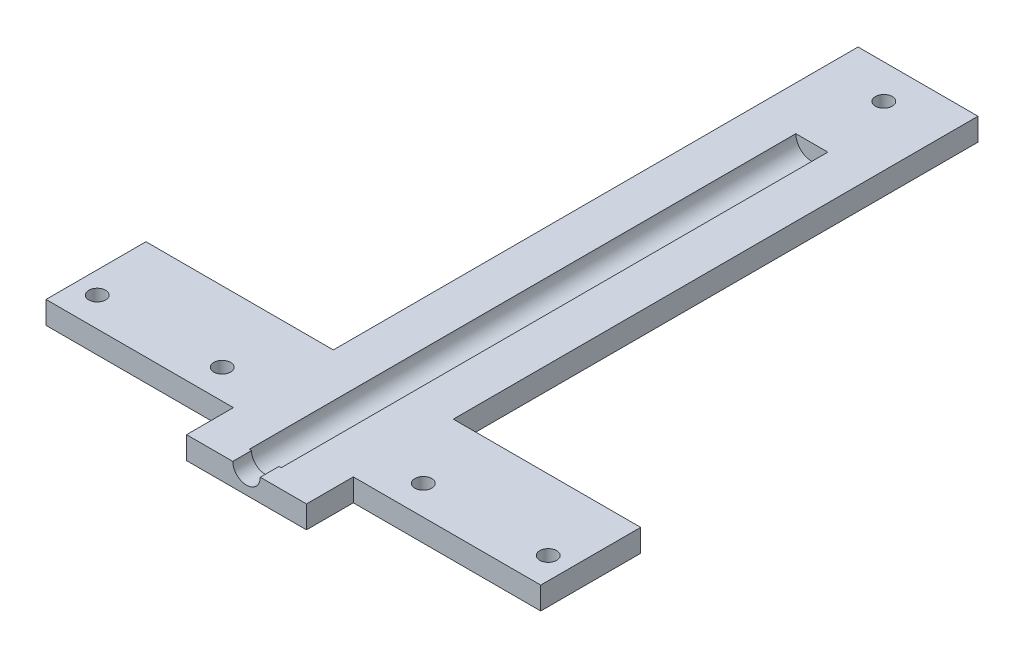
ISO-10303-21;
HEADER;
FILE_DESCRIPTION(('STEP AP214'),'2;1');
FILE_NAME('part.step','',(''),(''),'','','');
FILE_SCHEMA(('AUTOMOTIVE_DESIGN { 1 0 10303 214 1 1 1 1 }'));
ENDSEC;
DATA;
#1=APPLICATION_CONTEXT('core data for automotive mechanical design processes');
#2=APPLICATION_PROTOCOL_DEFINITION('international standard','automotive_design',2000,#1);
#3=PRODUCT_CONTEXT('',#1,'mechanical');
#4=PRODUCT('Part','Part','',(#3));
#5=PRODUCT_RELATED_PRODUCT_CATEGORY('part','',(#4));
#6=PRODUCT_DEFINITION_FORMATION('','',#4);
#7=PRODUCT_DEFINITION_CONTEXT('part definition',#1,'design');
#8=PRODUCT_DEFINITION('design','',#6,#7);
#9=PRODUCT_DEFINITION_SHAPE('','',#8);
#10=(LENGTH_UNIT() NAMED_UNIT(*) SI_UNIT(.MILLI.,.METRE.));
#11=(NAMED_UNIT(*) PLANE_ANGLE_UNIT() SI_UNIT($,.RADIAN.));
#12=(NAMED_UNIT(*) SI_UNIT($,.STERADIAN.) SOLID_ANGLE_UNIT());
#13=UNCERTAINTY_MEASURE_WITH_UNIT(LENGTH_MEASURE(1.E-05),#10,'distance_accuracy_value','');
#14=(GEOMETRIC_REPRESENTATION_CONTEXT(3) GLOBAL_UNCERTAINTY_ASSIGNED_CONTEXT((#13)) GLOBAL_UNIT_ASSIGNED_CONTEXT((#10,
#11,#12)) REPRESENTATION_CONTEXT('',''));
#15=CARTESIAN_POINT('',(0.,0.,0.));
#16=DIRECTION('',(0.,0.,1.));
#17=DIRECTION('',(1.,0.,0.));
#18=AXIS2_PLACEMENT_3D('',#15,#16,#17);
#19=CARTESIAN_POINT('',(0.,4.572,0.));
#20=DIRECTION('',(0.,1.,0.));
#21=DIRECTION('',(0.,0.,1.));
#22=AXIS2_PLACEMENT_3D('',#19,#20,#21);
#23=PLANE('',#22);
#24=CARTESIAN_POINT('',(-50.292,4.572,-120.0404));
#25=DIRECTION('',(0.,1.,0.));
#26=DIRECTION('',(0.,0.,1.));
#27=AXIS2_PLACEMENT_3D('',#24,#25,#26);
#28=CIRCLE('',#27,1.7145);
#29=CARTESIAN_POINT('',(-50.292,4.572,-118.3259));
#30=VERTEX_POINT('',#29);
#31=EDGE_CURVE('E222',#30,#30,#28,.T.);
#32=ORIENTED_EDGE('',*,*,#31,.F.);
#33=EDGE_LOOP('',(#32));
#34=FACE_BOUND('',#33,.T.);
#35=CARTESIAN_POINT('',(-70.739,4.572,-5.96899999999999));
#36=DIRECTION('',(0.,1.,0.));
#37=DIRECTION('',(0.,0.,1.));
#38=AXIS2_PLACEMENT_3D('',#35,#36,#37);
#39=CIRCLE('',#38,1.7145);
#40=CARTESIAN_POINT('',(-70.739,4.572,-4.25449999999999));
#41=VERTEX_POINT('',#40);
#42=EDGE_CURVE('E499',#41,#41,#39,.T.);
#43=ORIENTED_EDGE('',*,*,#42,.F.);
#44=EDGE_LOOP('',(#43));
#45=FACE_BOUND('',#44,.T.);
#46=CARTESIAN_POINT('',(-4.445,4.572,-5.96899999999999));
#47=DIRECTION('',(0.,1.,0.));
#48=DIRECTION('',(0.,0.,1.));
#49=AXIS2_PLACEMENT_3D('',#46,#47,#48);
#50=CIRCLE('',#49,1.7145);
#51=CARTESIAN_POINT('',(-4.445,4.572,-4.25449999999999));
#52=VERTEX_POINT('',#51);
#53=EDGE_CURVE('E502',#52,#52,#50,.T.);
#54=ORIENTED_EDGE('',*,*,#53,.F.);
#55=EDGE_LOOP('',(#54));
#56=FACE_BOUND('',#55,.T.);
#57=CARTESIAN_POINT('',(-29.845,4.572,-5.96899999999998));
#58=DIRECTION('',(0.,1.,0.));
#59=DIRECTION('',(0.,0.,1.));
#60=AXIS2_PLACEMENT_3D('',#57,#58,#59);
#61=CIRCLE('',#60,1.7145);
#62=CARTESIAN_POINT('',(-29.845,4.572,-4.25449999999998));
#63=VERTEX_POINT('',#62);
#64=EDGE_CURVE('E505',#63,#63,#61,.T.);
#65=ORIENTED_EDGE('',*,*,#64,.F.);
#66=EDGE_LOOP('',(#65));
#67=FACE_BOUND('',#66,.T.);
#68=CARTESIAN_POINT('',(-96.139,4.572,-5.96899999999999));
#69=DIRECTION('',(0.,1.,0.));
#70=DIRECTION('',(0.,0.,1.));
#71=AXIS2_PLACEMENT_3D('',#68,#69,#70);
#72=CIRCLE('',#71,1.7145);
#73=CARTESIAN_POINT('',(-96.139,4.572,-4.25449999999999));
#74=VERTEX_POINT('',#73);
#75=EDGE_CURVE('E508',#74,#74,#72,.T.);
#76=ORIENTED_EDGE('',*,*,#75,.F.);
#77=EDGE_LOOP('',(#76));
#78=FACE_BOUND('',#77,.T.);
#79=DIRECTION('',(0.,0.,1.));
#80=VECTOR('',#79,1.);
#81=CARTESIAN_POINT('',(-47.0408,4.572,-105.41));
#82=LINE('',#81,#80);
#83=CARTESIAN_POINT('',(-47.0408,4.572,-105.41));
#84=VERTEX_POINT('',#83);
#85=CARTESIAN_POINT('',(-47.0408,4.572,5.715));
#86=VERTEX_POINT('',#85);
#87=EDGE_CURVE('E474',#84,#86,#82,.T.);
#88=ORIENTED_EDGE('',*,*,#87,.T.);
#89=DIRECTION('',(-1.,0.,0.));
#90=VECTOR('',#89,1.);
#91=CARTESIAN_POINT('',(-53.5432,4.572,5.715));
#92=LINE('',#91,#90);
#93=CARTESIAN_POINT('',(-47.498,4.572,5.715));
#94=VERTEX_POINT('',#93);
#95=EDGE_CURVE('E470',#86,#94,#92,.T.);
#96=ORIENTED_EDGE('',*,*,#95,.T.);
#97=DIRECTION('',(0.,0.,1.));
#98=VECTOR('',#97,1.);
#99=CARTESIAN_POINT('',(-47.498,4.572,5.715));
#100=LINE('',#99,#98);
#101=CARTESIAN_POINT('',(-47.498,4.572,9.525));
#102=VERTEX_POINT('',#101);
#103=EDGE_CURVE('E490',#94,#102,#100,.T.);
#104=ORIENTED_EDGE('',*,*,#103,.T.);
#105=DIRECTION('',(-1.,0.,0.));
#106=VECTOR('',#105,1.);
#107=CARTESIAN_POINT('',(0.,4.572,9.525));
#108=LINE('',#107,#106);
#109=CARTESIAN_POINT('',(-38.1,4.572,9.525));
#110=VERTEX_POINT('',#109);
#111=EDGE_CURVE('E223',#110,#102,#108,.T.);
#112=ORIENTED_EDGE('',*,*,#111,.F.);
#113=DIRECTION('',(0.,0.,1.));
#114=VECTOR('',#113,1.);
#115=CARTESIAN_POINT('',(-38.1,4.572,0.));
#116=LINE('',#115,#114);
#117=CARTESIAN_POINT('',(-38.1,4.572,0.));
#118=VERTEX_POINT('',#117);
#119=EDGE_CURVE('E510',#118,#110,#116,.T.);
#120=ORIENTED_EDGE('',*,*,#119,.F.);
#121=DIRECTION('',(1.,0.,0.));
#122=VECTOR('',#121,1.);
#123=CARTESIAN_POINT('',(0.,4.572,0.));
#124=LINE('',#123,#122);
#125=CARTESIAN_POINT('',(0.,4.572,0.));
#126=VERTEX_POINT('',#125);
#127=EDGE_CURVE('E512',#118,#126,#124,.T.);
#128=ORIENTED_EDGE('',*,*,#127,.T.);
#129=DIRECTION('',(0.,0.,-1.));
#130=VECTOR('',#129,1.);
#131=CARTESIAN_POINT('',(0.,4.572,0.));
#132=LINE('',#131,#130);
#133=CARTESIAN_POINT('',(0.,4.572,-20.32));
#134=VERTEX_POINT('',#133);
#135=EDGE_CURVE('E185',#126,#134,#132,.T.);
#136=ORIENTED_EDGE('',*,*,#135,.T.);
#137=DIRECTION('',(-1.,0.,0.));
#138=VECTOR('',#137,1.);
#139=CARTESIAN_POINT('',(0.,4.572,-20.32));
#140=LINE('',#139,#138);
#141=CARTESIAN_POINT('',(-38.1,4.572,-20.32));
#142=VERTEX_POINT('',#141);
#143=EDGE_CURVE('E515',#134,#142,#140,.T.);
#144=ORIENTED_EDGE('',*,*,#143,.T.);
#145=DIRECTION('',(0.,0.,1.));
#146=VECTOR('',#145,1.);
#147=CARTESIAN_POINT('',(-38.1,4.572,0.));
#148=LINE('',#147,#146);
#149=CARTESIAN_POINT('',(-38.1,4.572,-127.));
#150=VERTEX_POINT('',#149);
#151=EDGE_CURVE('E517',#150,#142,#148,.T.);
#152=ORIENTED_EDGE('',*,*,#151,.F.);
#153=DIRECTION('',(-1.,0.,0.));
#154=VECTOR('',#153,1.);
#155=CARTESIAN_POINT('',(0.,4.572,-127.));
#156=LINE('',#155,#154);
#157=CARTESIAN_POINT('',(-62.484,4.572,-127.));
#158=VERTEX_POINT('',#157);
#159=EDGE_CURVE('E520',#150,#158,#156,.T.);
#160=ORIENTED_EDGE('',*,*,#159,.T.);
#161=DIRECTION('',(0.,0.,1.));
#162=VECTOR('',#161,1.);
#163=CARTESIAN_POINT('',(-62.484,4.572,0.));
#164=LINE('',#163,#162);
#165=CARTESIAN_POINT('',(-62.484,4.572,-20.32));
#166=VERTEX_POINT('',#165);
#167=EDGE_CURVE('E523',#158,#166,#164,.T.);
#168=ORIENTED_EDGE('',*,*,#167,.T.);
#169=DIRECTION('',(1.,0.,0.));
#170=VECTOR('',#169,1.);
#171=CARTESIAN_POINT('',(0.,4.572,-20.32));
#172=LINE('',#171,#170);
#173=CARTESIAN_POINT('',(-100.584,4.572,-20.32));
#174=VERTEX_POINT('',#173);
#175=EDGE_CURVE('E525',#174,#166,#172,.T.);
#176=ORIENTED_EDGE('',*,*,#175,.F.);
#177=DIRECTION('',(0.,0.,-1.));
#178=VECTOR('',#177,1.);
#179=CARTESIAN_POINT('',(-100.584,4.572,0.));
#180=LINE('',#179,#178);
#181=CARTESIAN_POINT('',(-100.584,4.572,0.));
#182=VERTEX_POINT('',#181);
#183=EDGE_CURVE('E151',#182,#174,#180,.T.);
#184=ORIENTED_EDGE('',*,*,#183,.F.);
#185=DIRECTION('',(1.,0.,0.));
#186=VECTOR('',#185,1.);
#187=CARTESIAN_POINT('',(0.,4.572,0.));
#188=LINE('',#187,#186);
#189=CARTESIAN_POINT('',(-62.484,4.572,0.));
#190=VERTEX_POINT('',#189);
#191=EDGE_CURVE('E144',#182,#190,#188,.T.);
#192=ORIENTED_EDGE('',*,*,#191,.T.);
#193=DIRECTION('',(0.,0.,1.));
#194=VECTOR('',#193,1.);
#195=CARTESIAN_POINT('',(-62.484,4.572,0.));
#196=LINE('',#195,#194);
#197=CARTESIAN_POINT('',(-62.484,4.572,9.525));
#198=VERTEX_POINT('',#197);
#199=EDGE_CURVE('E135',#190,#198,#196,.T.);
#200=ORIENTED_EDGE('',*,*,#199,.T.);
#201=CARTESIAN_POINT('',(-53.086,4.572,9.525));
#202=VERTEX_POINT('',#201);
#203=EDGE_CURVE('E143',#202,#198,#108,.T.);
#204=ORIENTED_EDGE('',*,*,#203,.F.);
#205=DIRECTION('',(0.,0.,1.));
#206=VECTOR('',#205,1.);
#207=CARTESIAN_POINT('',(-53.086,4.572,5.715));
#208=LINE('',#207,#206);
#209=CARTESIAN_POINT('',(-53.086,4.572,5.715));
#210=VERTEX_POINT('',#209);
#211=EDGE_CURVE('E233',#210,#202,#208,.T.);
#212=ORIENTED_EDGE('',*,*,#211,.F.);
#213=CARTESIAN_POINT('',(-53.5432,4.572,5.715));
#214=VERTEX_POINT('',#213);
#215=EDGE_CURVE('E483',#210,#214,#92,.T.);
#216=ORIENTED_EDGE('',*,*,#215,.T.);
#217=DIRECTION('',(0.,0.,1.));
#218=VECTOR('',#217,1.);
#219=CARTESIAN_POINT('',(-53.5432,4.572,-105.41));
#220=LINE('',#219,#218);
#221=CARTESIAN_POINT('',(-53.5432,4.572,-105.41));
#222=VERTEX_POINT('',#221);
#223=EDGE_CURVE('E476',#222,#214,#220,.T.);
#224=ORIENTED_EDGE('',*,*,#223,.F.);
#225=DIRECTION('',(-1.,0.,0.));
#226=VECTOR('',#225,1.);
#227=CARTESIAN_POINT('',(-53.5432,4.572,-105.41));
#228=LINE('',#227,#226);
#229=EDGE_CURVE('E464',#84,#222,#228,.T.);
#230=ORIENTED_EDGE('',*,*,#229,.F.);
#231=EDGE_LOOP('',(#88,#96,#104,#112,#120,#128,#136,#144,#152,#160,#168,#176,#184,#192,#200,
#204,#212,#216,#224,#230));
#232=FACE_BOUND('',#231,.T.);
#233=ADVANCED_FACE('F39',(#34,#45,#56,#67,#78,#232),#23,.T.);
#234=CARTESIAN_POINT('',(-38.1,4.572,0.));
#235=DIRECTION('',(1.,0.,0.));
#236=DIRECTION('',(0.,0.,-1.));
#237=AXIS2_PLACEMENT_3D('',#234,#235,#236);
#238=PLANE('',#237);
#239=DIRECTION('',(0.,0.,1.));
#240=VECTOR('',#239,1.);
#241=CARTESIAN_POINT('',(-38.1,0.,0.));
#242=LINE('',#241,#240);
#243=CARTESIAN_POINT('',(-38.1,0.,0.));
#244=VERTEX_POINT('',#243);
#245=CARTESIAN_POINT('',(-38.1,0.,9.525));
#246=VERTEX_POINT('',#245);
#247=EDGE_CURVE('E192',#244,#246,#242,.T.);
#248=ORIENTED_EDGE('',*,*,#247,.F.);
#249=DIRECTION('',(0.,-1.,0.));
#250=VECTOR('',#249,1.);
#251=CARTESIAN_POINT('',(-38.1,4.572,0.));
#252=LINE('',#251,#250);
#253=EDGE_CURVE('E11',#118,#244,#252,.T.);
#254=ORIENTED_EDGE('',*,*,#253,.F.);
#255=ORIENTED_EDGE('',*,*,#119,.T.);
#256=DIRECTION('',(0.,-1.,0.));
#257=VECTOR('',#256,1.);
#258=CARTESIAN_POINT('',(-38.1,4.572,9.525));
#259=LINE('',#258,#257);
#260=EDGE_CURVE('E56',#110,#246,#259,.T.);
#261=ORIENTED_EDGE('',*,*,#260,.T.);
#262=EDGE_LOOP('',(#248,#254,#255,#261));
#263=FACE_BOUND('',#262,.T.);
#264=ADVANCED_FACE('F262',(#263),#238,.T.);
#265=CARTESIAN_POINT('',(0.,4.572,0.));
#266=DIRECTION('',(0.,0.,-1.));
#267=DIRECTION('',(-1.,0.,0.));
#268=AXIS2_PLACEMENT_3D('',#265,#266,#267);
#269=PLANE('',#268);
#270=DIRECTION('',(1.,0.,0.));
#271=VECTOR('',#270,1.);
#272=CARTESIAN_POINT('',(0.,0.,0.));
#273=LINE('',#272,#271);
#274=CARTESIAN_POINT('',(0.,0.,0.));
#275=VERTEX_POINT('',#274);
#276=EDGE_CURVE('E189',#244,#275,#273,.T.);
#277=ORIENTED_EDGE('',*,*,#276,.T.);
#278=DIRECTION('',(0.,-1.,0.));
#279=VECTOR('',#278,1.);
#280=CARTESIAN_POINT('',(0.,4.572,0.));
#281=LINE('',#280,#279);
#282=EDGE_CURVE('E48',#126,#275,#281,.T.);
#283=ORIENTED_EDGE('',*,*,#282,.F.);
#284=ORIENTED_EDGE('',*,*,#127,.F.);
#285=ORIENTED_EDGE('',*,*,#253,.T.);
#286=EDGE_LOOP('',(#277,#283,#284,#285));
#287=FACE_BOUND('',#286,.T.);
#288=ADVANCED_FACE('F190',(#287),#269,.F.);
#289=CARTESIAN_POINT('',(0.,4.572,0.));
#290=DIRECTION('',(-1.,0.,0.));
#291=DIRECTION('',(0.,0.,1.));
#292=AXIS2_PLACEMENT_3D('',#289,#290,#291);
#293=PLANE('',#292);
#294=DIRECTION('',(0.,0.,-1.));
#295=VECTOR('',#294,1.);
#296=CARTESIAN_POINT('',(0.,0.,0.));
#297=LINE('',#296,#295);
#298=CARTESIAN_POINT('',(0.,0.,-20.32));
#299=VERTEX_POINT('',#298);
#300=EDGE_CURVE('E183',#275,#299,#297,.T.);
#301=ORIENTED_EDGE('',*,*,#300,.T.);
#302=DIRECTION('',(0.,-1.,0.));
#303=VECTOR('',#302,1.);
#304=CARTESIAN_POINT('',(0.,4.572,-20.32));
#305=LINE('',#304,#303);
#306=EDGE_CURVE('E174',#134,#299,#305,.T.);
#307=ORIENTED_EDGE('',*,*,#306,.F.);
#308=ORIENTED_EDGE('',*,*,#135,.F.);
#309=ORIENTED_EDGE('',*,*,#282,.T.);
#310=EDGE_LOOP('',(#301,#307,#308,#309));
#311=FACE_BOUND('',#310,.T.);
#312=ADVANCED_FACE('F181',(#311),#293,.F.);
#313=CARTESIAN_POINT('',(0.,4.572,-20.32));
#314=DIRECTION('',(0.,0.,1.));
#315=DIRECTION('',(1.,0.,0.));
#316=AXIS2_PLACEMENT_3D('',#313,#314,#315);
#317=PLANE('',#316);
#318=DIRECTION('',(-1.,0.,0.));
#319=VECTOR('',#318,1.);
#320=CARTESIAN_POINT('',(0.,0.,-20.32));
#321=LINE('',#320,#319);
#322=CARTESIAN_POINT('',(-38.1,0.,-20.32));
#323=VERTEX_POINT('',#322);
#324=EDGE_CURVE('E194',#299,#323,#321,.T.);
#325=ORIENTED_EDGE('',*,*,#324,.T.);
#326=DIRECTION('',(0.,-1.,0.));
#327=VECTOR('',#326,1.);
#328=CARTESIAN_POINT('',(-38.1,4.572,-20.32));
#329=LINE('',#328,#327);
#330=EDGE_CURVE('E172',#142,#323,#329,.T.);
#331=ORIENTED_EDGE('',*,*,#330,.F.);
#332=ORIENTED_EDGE('',*,*,#143,.F.);
#333=ORIENTED_EDGE('',*,*,#306,.T.);
#334=EDGE_LOOP('',(#325,#331,#332,#333));
#335=FACE_BOUND('',#334,.T.);
#336=ADVANCED_FACE('F301',(#335),#317,.F.);
#337=CARTESIAN_POINT('',(-38.1,4.572,0.));
#338=DIRECTION('',(1.,0.,0.));
#339=DIRECTION('',(0.,0.,-1.));
#340=AXIS2_PLACEMENT_3D('',#337,#338,#339);
#341=PLANE('',#340);
#342=DIRECTION('',(0.,0.,1.));
#343=VECTOR('',#342,1.);
#344=CARTESIAN_POINT('',(-38.1,0.,0.));
#345=LINE('',#344,#343);
#346=CARTESIAN_POINT('',(-38.1,0.,-127.));
#347=VERTEX_POINT('',#346);
#348=EDGE_CURVE('E202',#347,#323,#345,.T.);
#349=ORIENTED_EDGE('',*,*,#348,.F.);
#350=DIRECTION('',(0.,-1.,0.));
#351=VECTOR('',#350,1.);
#352=CARTESIAN_POINT('',(-38.1,4.572,-127.));
#353=LINE('',#352,#351);
#354=EDGE_CURVE('E170',#150,#347,#353,.T.);
#355=ORIENTED_EDGE('',*,*,#354,.F.);
#356=ORIENTED_EDGE('',*,*,#151,.T.);
#357=ORIENTED_EDGE('',*,*,#330,.T.);
#358=EDGE_LOOP('',(#349,#355,#356,#357));
#359=FACE_BOUND('',#358,.T.);
#360=ADVANCED_FACE('F297',(#359),#341,.T.);
#361=CARTESIAN_POINT('',(0.,4.572,-127.));
#362=DIRECTION('',(0.,0.,1.));
#363=DIRECTION('',(1.,0.,0.));
#364=AXIS2_PLACEMENT_3D('',#361,#362,#363);
#365=PLANE('',#364);
#366=DIRECTION('',(-1.,0.,0.));
#367=VECTOR('',#366,1.);
#368=CARTESIAN_POINT('',(0.,0.,-127.));
#369=LINE('',#368,#367);
#370=CARTESIAN_POINT('',(-62.484,0.,-127.));
#371=VERTEX_POINT('',#370);
#372=EDGE_CURVE('E205',#347,#371,#369,.T.);
#373=ORIENTED_EDGE('',*,*,#372,.T.);
#374=DIRECTION('',(0.,-1.,0.));
#375=VECTOR('',#374,1.);
#376=CARTESIAN_POINT('',(-62.484,4.572,-127.));
#377=LINE('',#376,#375);
#378=EDGE_CURVE('E167',#158,#371,#377,.T.);
#379=ORIENTED_EDGE('',*,*,#378,.F.);
#380=ORIENTED_EDGE('',*,*,#159,.F.);
#381=ORIENTED_EDGE('',*,*,#354,.T.);
#382=EDGE_LOOP('',(#373,#379,#380,#381));
#383=FACE_BOUND('',#382,.T.);
#384=ADVANCED_FACE('F293',(#383),#365,.F.);
#385=CARTESIAN_POINT('',(-62.484,4.572,0.));
#386=DIRECTION('',(1.,0.,0.));
#387=DIRECTION('',(0.,0.,-1.));
#388=AXIS2_PLACEMENT_3D('',#385,#386,#387);
#389=PLANE('',#388);
#390=DIRECTION('',(0.,0.,1.));
#391=VECTOR('',#390,1.);
#392=CARTESIAN_POINT('',(-62.484,0.,0.));
#393=LINE('',#392,#391);
#394=CARTESIAN_POINT('',(-62.484,0.,-20.32));
#395=VERTEX_POINT('',#394);
#396=EDGE_CURVE('E208',#371,#395,#393,.T.);
#397=ORIENTED_EDGE('',*,*,#396,.T.);
#398=DIRECTION('',(0.,-1.,0.));
#399=VECTOR('',#398,1.);
#400=CARTESIAN_POINT('',(-62.484,4.572,-20.32));
#401=LINE('',#400,#399);
#402=EDGE_CURVE('E165',#166,#395,#401,.T.);
#403=ORIENTED_EDGE('',*,*,#402,.F.);
#404=ORIENTED_EDGE('',*,*,#167,.F.);
#405=ORIENTED_EDGE('',*,*,#378,.T.);
#406=EDGE_LOOP('',(#397,#403,#404,#405));
#407=FACE_BOUND('',#406,.T.);
#408=ADVANCED_FACE('F289',(#407),#389,.F.);
#409=CARTESIAN_POINT('',(0.,4.572,-20.32));
#410=DIRECTION('',(0.,0.,-1.));
#411=DIRECTION('',(-1.,0.,0.));
#412=AXIS2_PLACEMENT_3D('',#409,#410,#411);
#413=PLANE('',#412);
#414=DIRECTION('',(1.,0.,0.));
#415=VECTOR('',#414,1.);
#416=CARTESIAN_POINT('',(0.,0.,-20.32));
#417=LINE('',#416,#415);
#418=CARTESIAN_POINT('',(-100.584,0.,-20.32));
#419=VERTEX_POINT('',#418);
#420=EDGE_CURVE('E211',#419,#395,#417,.T.);
#421=ORIENTED_EDGE('',*,*,#420,.F.);
#422=DIRECTION('',(0.,-1.,0.));
#423=VECTOR('',#422,1.);
#424=CARTESIAN_POINT('',(-100.584,4.572,-20.32));
#425=LINE('',#424,#423);
#426=EDGE_CURVE('E159',#174,#419,#425,.T.);
#427=ORIENTED_EDGE('',*,*,#426,.F.);
#428=ORIENTED_EDGE('',*,*,#175,.T.);
#429=ORIENTED_EDGE('',*,*,#402,.T.);
#430=EDGE_LOOP('',(#421,#427,#428,#429));
#431=FACE_BOUND('',#430,.T.);
#432=ADVANCED_FACE('F285',(#431),#413,.T.);
#433=CARTESIAN_POINT('',(-100.584,4.572,0.));
#434=DIRECTION('',(-1.,0.,0.));
#435=DIRECTION('',(0.,0.,1.));
#436=AXIS2_PLACEMENT_3D('',#433,#434,#435);
#437=PLANE('',#436);
#438=DIRECTION('',(0.,0.,-1.));
#439=VECTOR('',#438,1.);
#440=CARTESIAN_POINT('',(-100.584,0.,0.));
#441=LINE('',#440,#439);
#442=CARTESIAN_POINT('',(-100.584,0.,0.));
#443=VERTEX_POINT('',#442);
#444=EDGE_CURVE('E214',#443,#419,#441,.T.);
#445=ORIENTED_EDGE('',*,*,#444,.F.);
#446=DIRECTION('',(0.,-1.,0.));
#447=VECTOR('',#446,1.);
#448=CARTESIAN_POINT('',(-100.584,4.572,0.));
#449=LINE('',#448,#447);
#450=EDGE_CURVE('E157',#182,#443,#449,.T.);
#451=ORIENTED_EDGE('',*,*,#450,.F.);
#452=ORIENTED_EDGE('',*,*,#183,.T.);
#453=ORIENTED_EDGE('',*,*,#426,.T.);
#454=EDGE_LOOP('',(#445,#451,#452,#453));
#455=FACE_BOUND('',#454,.T.);
#456=ADVANCED_FACE('F282',(#455),#437,.T.);
#457=CARTESIAN_POINT('',(0.,4.572,0.));
#458=DIRECTION('',(0.,0.,-1.));
#459=DIRECTION('',(-1.,0.,0.));
#460=AXIS2_PLACEMENT_3D('',#457,#458,#459);
#461=PLANE('',#460);
#462=DIRECTION('',(1.,0.,0.));
#463=VECTOR('',#462,1.);
#464=CARTESIAN_POINT('',(0.,0.,0.));
#465=LINE('',#464,#463);
#466=CARTESIAN_POINT('',(-62.484,0.,0.));
#467=VERTEX_POINT('',#466);
#468=EDGE_CURVE('E156',#443,#467,#465,.T.);
#469=ORIENTED_EDGE('',*,*,#468,.T.);
#470=DIRECTION('',(0.,-1.,0.));
#471=VECTOR('',#470,1.);
#472=CARTESIAN_POINT('',(-62.484,4.572,0.));
#473=LINE('',#472,#471);
#474=EDGE_CURVE('E139',#190,#467,#473,.T.);
#475=ORIENTED_EDGE('',*,*,#474,.F.);
#476=ORIENTED_EDGE('',*,*,#191,.F.);
#477=ORIENTED_EDGE('',*,*,#450,.T.);
#478=EDGE_LOOP('',(#469,#475,#476,#477));
#479=FACE_BOUND('',#478,.T.);
#480=ADVANCED_FACE('F154',(#479),#461,.F.);
#481=CARTESIAN_POINT('',(-62.484,4.572,0.));
#482=DIRECTION('',(1.,0.,0.));
#483=DIRECTION('',(0.,0.,-1.));
#484=AXIS2_PLACEMENT_3D('',#481,#482,#483);
#485=PLANE('',#484);
#486=DIRECTION('',(0.,0.,1.));
#487=VECTOR('',#486,1.);
#488=CARTESIAN_POINT('',(-62.484,0.,0.));
#489=LINE('',#488,#487);
#490=CARTESIAN_POINT('',(-62.484,0.,9.525));
#491=VERTEX_POINT('',#490);
#492=EDGE_CURVE('E218',#467,#491,#489,.T.);
#493=ORIENTED_EDGE('',*,*,#492,.T.);
#494=DIRECTION('',(0.,-1.,0.));
#495=VECTOR('',#494,1.);
#496=CARTESIAN_POINT('',(-62.484,4.572,9.525));
#497=LINE('',#496,#495);
#498=EDGE_CURVE('E95',#198,#491,#497,.T.);
#499=ORIENTED_EDGE('',*,*,#498,.F.);
#500=ORIENTED_EDGE('',*,*,#199,.F.);
#501=ORIENTED_EDGE('',*,*,#474,.T.);
#502=EDGE_LOOP('',(#493,#499,#500,#501));
#503=FACE_BOUND('',#502,.T.);
#504=ADVANCED_FACE('F137',(#503),#485,.F.);
#505=CARTESIAN_POINT('',(-96.139,4.572,-5.96899999999999));
#506=DIRECTION('',(0.,-1.,0.));
#507=DIRECTION('',(0.,0.,-1.));
#508=AXIS2_PLACEMENT_3D('',#505,#506,#507);
#509=CYLINDRICAL_SURFACE('',#508,1.7145);
#510=ORIENTED_EDGE('',*,*,#75,.T.);
#511=EDGE_LOOP('',(#510));
#512=FACE_BOUND('',#511,.T.);
#513=CARTESIAN_POINT('',(-96.139,0.,-5.96899999999999));
#514=DIRECTION('',(0.,1.,0.));
#515=DIRECTION('',(0.,0.,1.));
#516=AXIS2_PLACEMENT_3D('',#513,#514,#515);
#517=CIRCLE('',#516,1.7145);
#518=CARTESIAN_POINT('',(-96.139,0.,-4.25449999999999));
#519=VERTEX_POINT('',#518);
#520=EDGE_CURVE('E196',#519,#519,#517,.T.);
#521=ORIENTED_EDGE('',*,*,#520,.F.);
#522=EDGE_LOOP('',(#521));
#523=FACE_BOUND('',#522,.T.);
#524=ADVANCED_FACE('F246',(#512,#523),#509,.F.);
#525=CARTESIAN_POINT('',(-29.845,4.572,-5.96899999999998));
#526=DIRECTION('',(0.,-1.,0.));
#527=DIRECTION('',(0.,0.,-1.));
#528=AXIS2_PLACEMENT_3D('',#525,#526,#527);
#529=CYLINDRICAL_SURFACE('',#528,1.7145);
#530=ORIENTED_EDGE('',*,*,#64,.T.);
#531=EDGE_LOOP('',(#530));
#532=FACE_BOUND('',#531,.T.);
#533=CARTESIAN_POINT('',(-29.845,0.,-5.96899999999998));
#534=DIRECTION('',(0.,1.,0.));
#535=DIRECTION('',(0.,0.,1.));
#536=AXIS2_PLACEMENT_3D('',#533,#534,#535);
#537=CIRCLE('',#536,1.7145);
#538=CARTESIAN_POINT('',(-29.845,0.,-4.25449999999998));
#539=VERTEX_POINT('',#538);
#540=EDGE_CURVE('E239',#539,#539,#537,.T.);
#541=ORIENTED_EDGE('',*,*,#540,.F.);
#542=EDGE_LOOP('',(#541));
#543=FACE_BOUND('',#542,.T.);
#544=ADVANCED_FACE('F248',(#532,#543),#529,.F.);
#545=CARTESIAN_POINT('',(-4.445,4.572,-5.96899999999999));
#546=DIRECTION('',(0.,-1.,0.));
#547=DIRECTION('',(0.,0.,-1.));
#548=AXIS2_PLACEMENT_3D('',#545,#546,#547);
#549=CYLINDRICAL_SURFACE('',#548,1.7145);
#550=ORIENTED_EDGE('',*,*,#53,.T.);
#551=EDGE_LOOP('',(#550));
#552=FACE_BOUND('',#551,.T.);
#553=CARTESIAN_POINT('',(-4.445,0.,-5.96899999999999));
#554=DIRECTION('',(0.,1.,0.));
#555=DIRECTION('',(0.,0.,1.));
#556=AXIS2_PLACEMENT_3D('',#553,#554,#555);
#557=CIRCLE('',#556,1.7145);
#558=CARTESIAN_POINT('',(-4.445,0.,-4.25449999999999));
#559=VERTEX_POINT('',#558);
#560=EDGE_CURVE('E236',#559,#559,#557,.T.);
#561=ORIENTED_EDGE('',*,*,#560,.F.);
#562=EDGE_LOOP('',(#561));
#563=FACE_BOUND('',#562,.T.);
#564=ADVANCED_FACE('F255',(#552,#563),#549,.F.);
#565=CARTESIAN_POINT('',(-70.739,4.572,-5.96899999999999));
#566=DIRECTION('',(0.,-1.,0.));
#567=DIRECTION('',(0.,0.,-1.));
#568=AXIS2_PLACEMENT_3D('',#565,#566,#567);
#569=CYLINDRICAL_SURFACE('',#568,1.7145);
#570=ORIENTED_EDGE('',*,*,#42,.T.);
#571=EDGE_LOOP('',(#570));
#572=FACE_BOUND('',#571,.T.);
#573=CARTESIAN_POINT('',(-70.739,0.,-5.96899999999999));
#574=DIRECTION('',(0.,1.,0.));
#575=DIRECTION('',(0.,0.,1.));
#576=AXIS2_PLACEMENT_3D('',#573,#574,#575);
#577=CIRCLE('',#576,1.7145);
#578=CARTESIAN_POINT('',(-70.739,0.,-4.25449999999999));
#579=VERTEX_POINT('',#578);
#580=EDGE_CURVE('E232',#579,#579,#577,.T.);
#581=ORIENTED_EDGE('',*,*,#580,.F.);
#582=EDGE_LOOP('',(#581));
#583=FACE_BOUND('',#582,.T.);
#584=ADVANCED_FACE('F371',(#572,#583),#569,.F.);
#585=CARTESIAN_POINT('',(-50.292,4.572,-120.0404));
#586=DIRECTION('',(0.,-1.,0.));
#587=DIRECTION('',(0.,0.,-1.));
#588=AXIS2_PLACEMENT_3D('',#585,#586,#587);
#589=CYLINDRICAL_SURFACE('',#588,1.7145);
#590=ORIENTED_EDGE('',*,*,#31,.T.);
#591=EDGE_LOOP('',(#590));
#592=FACE_BOUND('',#591,.T.);
#593=CARTESIAN_POINT('',(-50.292,0.,-120.0404));
#594=DIRECTION('',(0.,1.,0.));
#595=DIRECTION('',(0.,0.,1.));
#596=AXIS2_PLACEMENT_3D('',#593,#594,#595);
#597=CIRCLE('',#596,1.7145);
#598=CARTESIAN_POINT('',(-50.292,0.,-118.3259));
#599=VERTEX_POINT('',#598);
#600=EDGE_CURVE('E229',#599,#599,#597,.T.);
#601=ORIENTED_EDGE('',*,*,#600,.F.);
#602=EDGE_LOOP('',(#601));
#603=FACE_BOUND('',#602,.T.);
#604=ADVANCED_FACE('F41',(#592,#603),#589,.F.);
#605=CARTESIAN_POINT('',(0.,4.572,9.525));
#606=DIRECTION('',(0.,0.,1.));
#607=DIRECTION('',(1.,0.,0.));
#608=AXIS2_PLACEMENT_3D('',#605,#606,#607);
#609=PLANE('',#608);
#610=CARTESIAN_POINT('',(-50.292,4.572,9.525));
#611=DIRECTION('',(0.,0.,1.));
#612=DIRECTION('',(-1.,0.,0.));
#613=AXIS2_PLACEMENT_3D('',#610,#611,#612);
#614=CIRCLE('',#613,2.794);
#615=EDGE_CURVE('E485',#202,#102,#614,.T.);
#616=ORIENTED_EDGE('',*,*,#615,.F.);
#617=ORIENTED_EDGE('',*,*,#203,.T.);
#618=ORIENTED_EDGE('',*,*,#498,.T.);
#619=DIRECTION('',(-1.,0.,0.));
#620=VECTOR('',#619,1.);
#621=CARTESIAN_POINT('',(0.,0.,9.525));
#622=LINE('',#621,#620);
#623=EDGE_CURVE('E220',#246,#491,#622,.T.);
#624=ORIENTED_EDGE('',*,*,#623,.F.);
#625=ORIENTED_EDGE('',*,*,#260,.F.);
#626=ORIENTED_EDGE('',*,*,#111,.T.);
#627=EDGE_LOOP('',(#616,#617,#618,#624,#625,#626));
#628=FACE_BOUND('',#627,.T.);
#629=ADVANCED_FACE('F276',(#628),#609,.T.);
#630=CARTESIAN_POINT('',(0.,0.,0.));
#631=DIRECTION('',(0.,1.,0.));
#632=DIRECTION('',(0.,0.,1.));
#633=AXIS2_PLACEMENT_3D('',#630,#631,#632);
#634=PLANE('',#633);
#635=ORIENTED_EDGE('',*,*,#600,.T.);
#636=EDGE_LOOP('',(#635));
#637=FACE_BOUND('',#636,.T.);
#638=ORIENTED_EDGE('',*,*,#580,.T.);
#639=EDGE_LOOP('',(#638));
#640=FACE_BOUND('',#639,.T.);
#641=ORIENTED_EDGE('',*,*,#560,.T.);
#642=EDGE_LOOP('',(#641));
#643=FACE_BOUND('',#642,.T.);
#644=ORIENTED_EDGE('',*,*,#540,.T.);
#645=EDGE_LOOP('',(#644));
#646=FACE_BOUND('',#645,.T.);
#647=ORIENTED_EDGE('',*,*,#520,.T.);
#648=EDGE_LOOP('',(#647));
#649=FACE_BOUND('',#648,.T.);
#650=ORIENTED_EDGE('',*,*,#247,.T.);
#651=ORIENTED_EDGE('',*,*,#623,.T.);
#652=ORIENTED_EDGE('',*,*,#492,.F.);
#653=ORIENTED_EDGE('',*,*,#468,.F.);
#654=ORIENTED_EDGE('',*,*,#444,.T.);
#655=ORIENTED_EDGE('',*,*,#420,.T.);
#656=ORIENTED_EDGE('',*,*,#396,.F.);
#657=ORIENTED_EDGE('',*,*,#372,.F.);
#658=ORIENTED_EDGE('',*,*,#348,.T.);
#659=ORIENTED_EDGE('',*,*,#324,.F.);
#660=ORIENTED_EDGE('',*,*,#300,.F.);
#661=ORIENTED_EDGE('',*,*,#276,.F.);
#662=EDGE_LOOP('',(#650,#651,#652,#653,#654,#655,#656,#657,#658,#659,#660,#661));
#663=FACE_BOUND('',#662,.T.);
#664=ADVANCED_FACE('F244',(#637,#640,#643,#646,#649,#663),#634,.F.);
#665=CARTESIAN_POINT('',(-50.292,4.572,5.715));
#666=DIRECTION('',(0.,0.,1.));
#667=DIRECTION('',(1.,0.,0.));
#668=AXIS2_PLACEMENT_3D('',#665,#666,#667);
#669=CYLINDRICAL_SURFACE('',#668,2.794);
#670=ORIENTED_EDGE('',*,*,#615,.T.);
#671=ORIENTED_EDGE('',*,*,#103,.F.);
#672=CARTESIAN_POINT('',(-50.292,4.572,5.715));
#673=DIRECTION('',(0.,0.,1.));
#674=DIRECTION('',(-1.,0.,0.));
#675=AXIS2_PLACEMENT_3D('',#672,#673,#674);
#676=CIRCLE('',#675,2.794);
#677=EDGE_CURVE('E487',#210,#94,#676,.T.);
#678=ORIENTED_EDGE('',*,*,#677,.F.);
#679=ORIENTED_EDGE('',*,*,#211,.T.);
#680=EDGE_LOOP('',(#670,#671,#678,#679));
#681=FACE_BOUND('',#680,.T.);
#682=ADVANCED_FACE('F272',(#681),#669,.F.);
#683=CARTESIAN_POINT('',(-50.292,4.572,5.715));
#684=DIRECTION('',(0.,0.,-1.));
#685=DIRECTION('',(-1.,0.,0.));
#686=AXIS2_PLACEMENT_3D('',#683,#684,#685);
#687=PLANE('',#686);
#688=ORIENTED_EDGE('',*,*,#677,.T.);
#689=ORIENTED_EDGE('',*,*,#95,.F.);
#690=CARTESIAN_POINT('',(-50.292,4.572,5.715));
#691=DIRECTION('',(0.,0.,1.));
#692=DIRECTION('',(-1.,0.,0.));
#693=AXIS2_PLACEMENT_3D('',#690,#691,#692);
#694=CIRCLE('',#693,3.2512);
#695=EDGE_CURVE('E480',#214,#86,#694,.T.);
#696=ORIENTED_EDGE('',*,*,#695,.F.);
#697=ORIENTED_EDGE('',*,*,#215,.F.);
#698=EDGE_LOOP('',(#688,#689,#696,#697));
#699=FACE_BOUND('',#698,.T.);
#700=ADVANCED_FACE('F420',(#699),#687,.T.);
#701=CARTESIAN_POINT('',(-50.292,4.572,-105.41));
#702=DIRECTION('',(0.,0.,1.));
#703=DIRECTION('',(1.,0.,0.));
#704=AXIS2_PLACEMENT_3D('',#701,#702,#703);
#705=CYLINDRICAL_SURFACE('',#704,3.2512);
#706=ORIENTED_EDGE('',*,*,#695,.T.);
#707=ORIENTED_EDGE('',*,*,#87,.F.);
#708=CARTESIAN_POINT('',(-50.292,4.572,-105.41));
#709=DIRECTION('',(0.,0.,1.));
#710=DIRECTION('',(-1.,0.,0.));
#711=AXIS2_PLACEMENT_3D('',#708,#709,#710);
#712=CIRCLE('',#711,3.2512);
#713=EDGE_CURVE('E461',#222,#84,#712,.T.);
#714=ORIENTED_EDGE('',*,*,#713,.F.);
#715=ORIENTED_EDGE('',*,*,#223,.T.);
#716=EDGE_LOOP('',(#706,#707,#714,#715));
#717=FACE_BOUND('',#716,.T.);
#718=ADVANCED_FACE('F429',(#717),#705,.F.);
#719=CARTESIAN_POINT('',(-50.292,4.572,-105.41));
#720=DIRECTION('',(0.,0.,-1.));
#721=DIRECTION('',(-1.,0.,0.));
#722=AXIS2_PLACEMENT_3D('',#719,#720,#721);
#723=PLANE('',#722);
#724=ORIENTED_EDGE('',*,*,#713,.T.);
#725=ORIENTED_EDGE('',*,*,#229,.T.);
#726=EDGE_LOOP('',(#724,#725));
#727=FACE_BOUND('',#726,.T.);
#728=ADVANCED_FACE('F439',(#727),#723,.F.);
#729=CLOSED_SHELL('',(#233,#264,#288,#312,#336,#360,#384,#408,#432,#456,#480,#504,#524,#544,
#564,#584,#604,#629,#664,#682,#700,#718,#728));
#730=MANIFOLD_SOLID_BREP('B2',#729);
#731=ADVANCED_BREP_SHAPE_REPRESENTATION('',(#18,#730),#14);
#732=SHAPE_DEFINITION_REPRESENTATION(#9,#731);
ENDSEC;
END-ISO-10303-21;
